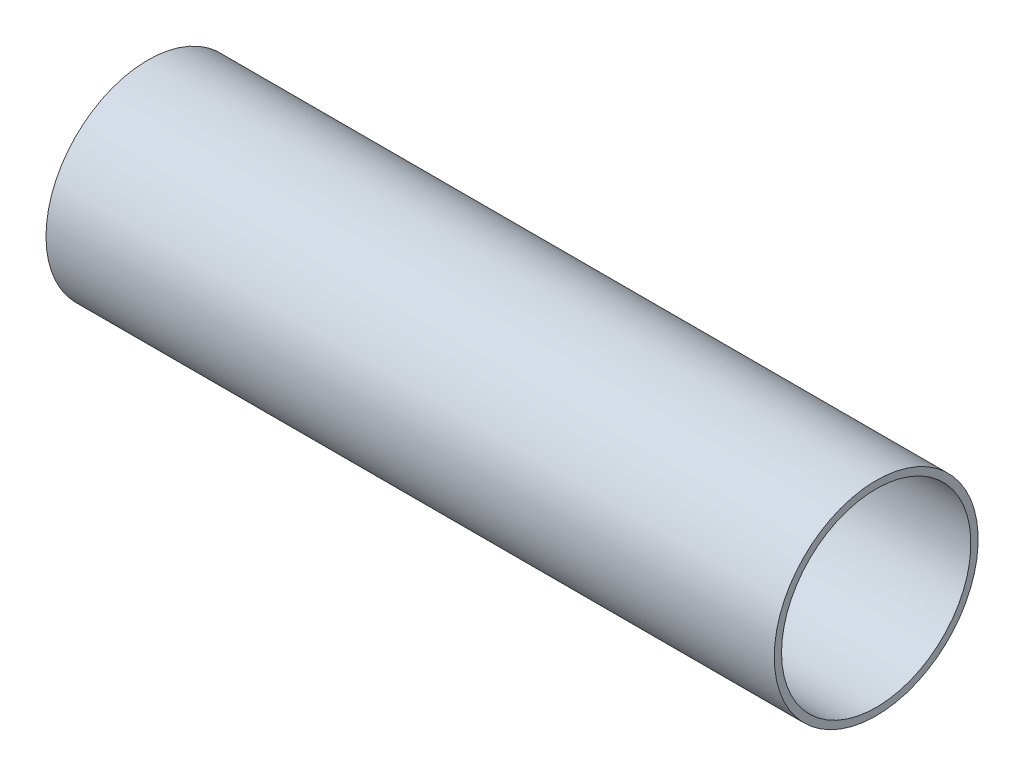
ISO-10303-21;
HEADER;
FILE_DESCRIPTION(('STEP AP214'),'2;1');
FILE_NAME('part.step','',(''),(''),'','','');
FILE_SCHEMA(('AUTOMOTIVE_DESIGN { 1 0 10303 214 1 1 1 1 }'));
ENDSEC;
DATA;
#1=APPLICATION_CONTEXT('core data for automotive mechanical design processes');
#2=APPLICATION_PROTOCOL_DEFINITION('international standard','automotive_design',2000,#1);
#3=PRODUCT_CONTEXT('',#1,'mechanical');
#4=PRODUCT('Part','Part','',(#3));
#5=PRODUCT_RELATED_PRODUCT_CATEGORY('part','',(#4));
#6=PRODUCT_DEFINITION_FORMATION('','',#4);
#7=PRODUCT_DEFINITION_CONTEXT('part definition',#1,'design');
#8=PRODUCT_DEFINITION('design','',#6,#7);
#9=PRODUCT_DEFINITION_SHAPE('','',#8);
#10=(LENGTH_UNIT() NAMED_UNIT(*) SI_UNIT(.MILLI.,.METRE.));
#11=(NAMED_UNIT(*) PLANE_ANGLE_UNIT() SI_UNIT($,.RADIAN.));
#12=(NAMED_UNIT(*) SI_UNIT($,.STERADIAN.) SOLID_ANGLE_UNIT());
#13=UNCERTAINTY_MEASURE_WITH_UNIT(LENGTH_MEASURE(1.E-05),#10,'distance_accuracy_value','');
#14=(GEOMETRIC_REPRESENTATION_CONTEXT(3) GLOBAL_UNCERTAINTY_ASSIGNED_CONTEXT((#13)) GLOBAL_UNIT_ASSIGNED_CONTEXT((#10,
#11,#12)) REPRESENTATION_CONTEXT('',''));
#15=CARTESIAN_POINT('',(0.,0.,0.));
#16=DIRECTION('',(0.,0.,1.));
#17=DIRECTION('',(1.,0.,0.));
#18=AXIS2_PLACEMENT_3D('',#15,#16,#17);
#19=CARTESIAN_POINT('',(0.,14.,0.));
#20=DIRECTION('',(1.,0.,0.));
#21=DIRECTION('',(0.,0.,-1.));
#22=AXIS2_PLACEMENT_3D('',#19,#20,#21);
#23=PLANE('',#22);
#24=CARTESIAN_POINT('',(0.,0.,0.));
#25=DIRECTION('',(-1.,0.,0.));
#26=DIRECTION('',(0.,0.,1.));
#27=AXIS2_PLACEMENT_3D('',#24,#25,#26);
#28=CIRCLE('',#27,13.);
#29=CARTESIAN_POINT('',(0.,0.,13.));
#30=VERTEX_POINT('',#29);
#31=EDGE_CURVE('E53',#30,#30,#28,.T.);
#32=ORIENTED_EDGE('',*,*,#31,.F.);
#33=EDGE_LOOP('',(#32));
#34=FACE_BOUND('',#33,.T.);
#35=CARTESIAN_POINT('',(0.,0.,0.));
#36=DIRECTION('',(-1.,0.,0.));
#37=DIRECTION('',(0.,0.,1.));
#38=AXIS2_PLACEMENT_3D('',#35,#36,#37);
#39=CIRCLE('',#38,14.);
#40=CARTESIAN_POINT('',(0.,0.,14.));
#41=VERTEX_POINT('',#40);
#42=EDGE_CURVE('E11',#41,#41,#39,.T.);
#43=ORIENTED_EDGE('',*,*,#42,.T.);
#44=EDGE_LOOP('',(#43));
#45=FACE_BOUND('',#44,.T.);
#46=ADVANCED_FACE('F37',(#34,#45),#23,.F.);
#47=CARTESIAN_POINT('',(0.,0.,0.));
#48=DIRECTION('',(-1.,0.,0.));
#49=DIRECTION('',(0.,0.,1.));
#50=AXIS2_PLACEMENT_3D('',#47,#48,#49);
#51=CYLINDRICAL_SURFACE('',#50,14.);
#52=CARTESIAN_POINT('',(100.,0.,0.));
#53=DIRECTION('',(-1.,0.,0.));
#54=DIRECTION('',(0.,0.,1.));
#55=AXIS2_PLACEMENT_3D('',#52,#53,#54);
#56=CIRCLE('',#55,14.);
#57=CARTESIAN_POINT('',(100.,0.,14.));
#58=VERTEX_POINT('',#57);
#59=EDGE_CURVE('E45',#58,#58,#56,.T.);
#60=ORIENTED_EDGE('',*,*,#59,.T.);
#61=EDGE_LOOP('',(#60));
#62=FACE_BOUND('',#61,.T.);
#63=ORIENTED_EDGE('',*,*,#42,.F.);
#64=EDGE_LOOP('',(#63));
#65=FACE_BOUND('',#64,.T.);
#66=ADVANCED_FACE('F63',(#62,#65),#51,.T.);
#67=CARTESIAN_POINT('',(100.,13.,0.));
#68=DIRECTION('',(-1.,0.,0.));
#69=DIRECTION('',(0.,0.,1.));
#70=AXIS2_PLACEMENT_3D('',#67,#68,#69);
#71=PLANE('',#70);
#72=ORIENTED_EDGE('',*,*,#59,.F.);
#73=EDGE_LOOP('',(#72));
#74=FACE_BOUND('',#73,.T.);
#75=CARTESIAN_POINT('',(100.,0.,0.));
#76=DIRECTION('',(-1.,0.,0.));
#77=DIRECTION('',(0.,0.,1.));
#78=AXIS2_PLACEMENT_3D('',#75,#76,#77);
#79=CIRCLE('',#78,13.);
#80=CARTESIAN_POINT('',(100.,0.,13.));
#81=VERTEX_POINT('',#80);
#82=EDGE_CURVE('E49',#81,#81,#79,.T.);
#83=ORIENTED_EDGE('',*,*,#82,.T.);
#84=EDGE_LOOP('',(#83));
#85=FACE_BOUND('',#84,.T.);
#86=ADVANCED_FACE('F67',(#74,#85),#71,.F.);
#87=CARTESIAN_POINT('',(0.,0.,0.));
#88=DIRECTION('',(-1.,0.,0.));
#89=DIRECTION('',(0.,0.,1.));
#90=AXIS2_PLACEMENT_3D('',#87,#88,#89);
#91=CYLINDRICAL_SURFACE('',#90,13.);
#92=ORIENTED_EDGE('',*,*,#31,.T.);
#93=EDGE_LOOP('',(#92));
#94=FACE_BOUND('',#93,.T.);
#95=ORIENTED_EDGE('',*,*,#82,.F.);
#96=EDGE_LOOP('',(#95));
#97=FACE_BOUND('',#96,.T.);
#98=ADVANCED_FACE('F59',(#94,#97),#91,.F.);
#99=CLOSED_SHELL('',(#46,#66,#86,#98));
#100=MANIFOLD_SOLID_BREP('B2',#99);
#101=ADVANCED_BREP_SHAPE_REPRESENTATION('',(#18,#100),#14);
#102=SHAPE_DEFINITION_REPRESENTATION(#9,#101);
ENDSEC;
END-ISO-10303-21;
